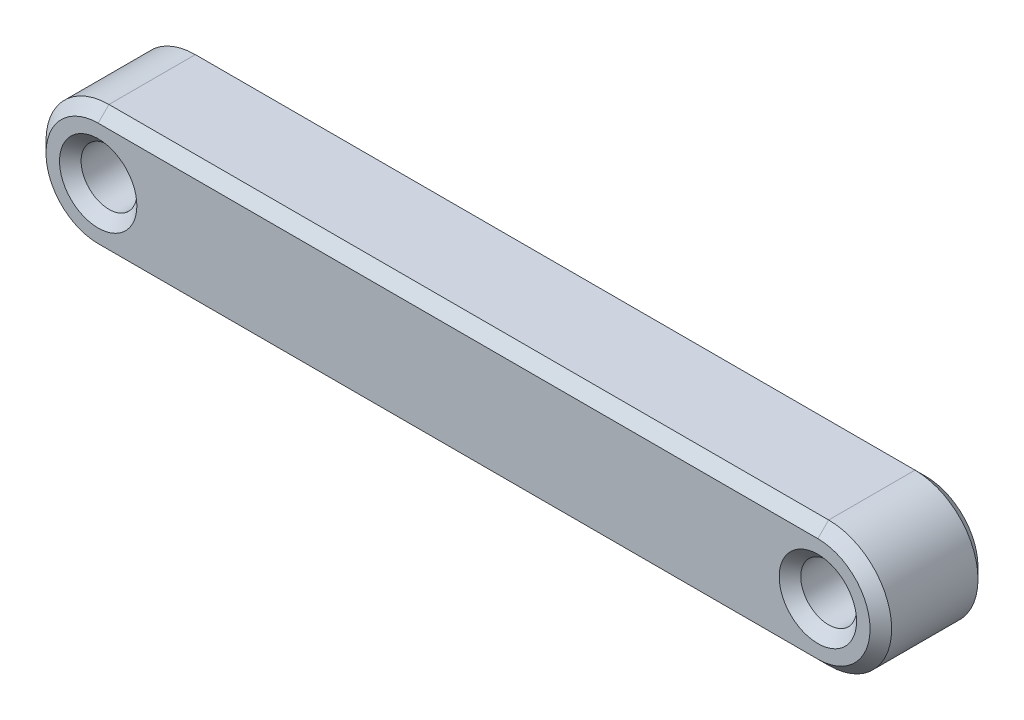
ISO-10303-21;
HEADER;
FILE_DESCRIPTION(('STEP AP214'),'2;1');
FILE_NAME('part.step','',(''),(''),'','','');
FILE_SCHEMA(('AUTOMOTIVE_DESIGN { 1 0 10303 214 1 1 1 1 }'));
ENDSEC;
DATA;
#1=APPLICATION_CONTEXT('core data for automotive mechanical design processes');
#2=APPLICATION_PROTOCOL_DEFINITION('international standard','automotive_design',2000,#1);
#3=PRODUCT_CONTEXT('',#1,'mechanical');
#4=PRODUCT('Part','Part','',(#3));
#5=PRODUCT_RELATED_PRODUCT_CATEGORY('part','',(#4));
#6=PRODUCT_DEFINITION_FORMATION('','',#4);
#7=PRODUCT_DEFINITION_CONTEXT('part definition',#1,'design');
#8=PRODUCT_DEFINITION('design','',#6,#7);
#9=PRODUCT_DEFINITION_SHAPE('','',#8);
#10=(LENGTH_UNIT() NAMED_UNIT(*) SI_UNIT(.MILLI.,.METRE.));
#11=(NAMED_UNIT(*) PLANE_ANGLE_UNIT() SI_UNIT($,.RADIAN.));
#12=(NAMED_UNIT(*) SI_UNIT($,.STERADIAN.) SOLID_ANGLE_UNIT());
#13=UNCERTAINTY_MEASURE_WITH_UNIT(LENGTH_MEASURE(1.E-05),#10,'distance_accuracy_value','');
#14=(GEOMETRIC_REPRESENTATION_CONTEXT(3) GLOBAL_UNCERTAINTY_ASSIGNED_CONTEXT((#13)) GLOBAL_UNIT_ASSIGNED_CONTEXT((#10,
#11,#12)) REPRESENTATION_CONTEXT('',''));
#15=CARTESIAN_POINT('',(0.,0.,0.));
#16=DIRECTION('',(0.,0.,1.));
#17=DIRECTION('',(1.,0.,0.));
#18=AXIS2_PLACEMENT_3D('',#15,#16,#17);
#19=CARTESIAN_POINT('',(0.,-3.5,6.));
#20=DIRECTION('',(0.,1.,0.));
#21=DIRECTION('',(0.,0.,1.));
#22=AXIS2_PLACEMENT_3D('',#19,#20,#21);
#23=PLANE('',#22);
#24=DIRECTION('',(0.,0.,-1.));
#25=VECTOR('',#24,1.);
#26=CARTESIAN_POINT('',(0.,-3.5,6.));
#27=LINE('',#26,#25);
#28=CARTESIAN_POINT('',(0.,-3.5,5.4));
#29=VERTEX_POINT('',#28);
#30=CARTESIAN_POINT('',(0.,-3.5,0.599999999999996));
#31=VERTEX_POINT('',#30);
#32=EDGE_CURVE('E185',#29,#31,#27,.T.);
#33=ORIENTED_EDGE('',*,*,#32,.T.);
#34=DIRECTION('',(1.,0.,0.));
#35=VECTOR('',#34,1.);
#36=CARTESIAN_POINT('',(0.,-3.5,0.599999999999996));
#37=LINE('',#36,#35);
#38=CARTESIAN_POINT('',(40.,-3.5,0.599999999999996));
#39=VERTEX_POINT('',#38);
#40=EDGE_CURVE('E171',#31,#39,#37,.T.);
#41=ORIENTED_EDGE('',*,*,#40,.T.);
#42=DIRECTION('',(0.,0.,-1.));
#43=VECTOR('',#42,1.);
#44=CARTESIAN_POINT('',(40.,-3.5,6.));
#45=LINE('',#44,#43);
#46=CARTESIAN_POINT('',(40.,-3.5,5.4));
#47=VERTEX_POINT('',#46);
#48=EDGE_CURVE('E130',#47,#39,#45,.T.);
#49=ORIENTED_EDGE('',*,*,#48,.F.);
#50=DIRECTION('',(-1.,0.,0.));
#51=VECTOR('',#50,1.);
#52=CARTESIAN_POINT('',(0.,-3.5,5.4));
#53=LINE('',#52,#51);
#54=EDGE_CURVE('E169',#47,#29,#53,.T.);
#55=ORIENTED_EDGE('',*,*,#54,.T.);
#56=EDGE_LOOP('',(#33,#41,#49,#55));
#57=FACE_BOUND('',#56,.T.);
#58=ADVANCED_FACE('F41',(#57),#23,.F.);
#59=CARTESIAN_POINT('',(40.,0.,6.));
#60=DIRECTION('',(0.,0.,-1.));
#61=DIRECTION('',(-1.,0.,0.));
#62=AXIS2_PLACEMENT_3D('',#59,#60,#61);
#63=CYLINDRICAL_SURFACE('',#62,3.5);
#64=ORIENTED_EDGE('',*,*,#48,.T.);
#65=CARTESIAN_POINT('',(40.,0.,0.599999999999996));
#66=DIRECTION('',(0.,0.,1.));
#67=DIRECTION('',(1.,0.,0.));
#68=AXIS2_PLACEMENT_3D('',#65,#66,#67);
#69=CIRCLE('',#68,3.5);
#70=CARTESIAN_POINT('',(40.,3.5,0.599999999999996));
#71=VERTEX_POINT('',#70);
#72=EDGE_CURVE('E116',#39,#71,#69,.T.);
#73=ORIENTED_EDGE('',*,*,#72,.T.);
#74=DIRECTION('',(0.,0.,-1.));
#75=VECTOR('',#74,1.);
#76=CARTESIAN_POINT('',(40.,3.5,6.));
#77=LINE('',#76,#75);
#78=CARTESIAN_POINT('',(40.,3.5,5.4));
#79=VERTEX_POINT('',#78);
#80=EDGE_CURVE('E207',#79,#71,#77,.T.);
#81=ORIENTED_EDGE('',*,*,#80,.F.);
#82=CARTESIAN_POINT('',(40.,0.,5.4));
#83=DIRECTION('',(0.,0.,1.));
#84=DIRECTION('',(1.,0.,0.));
#85=AXIS2_PLACEMENT_3D('',#82,#83,#84);
#86=CIRCLE('',#85,3.5);
#87=EDGE_CURVE('E157',#79,#47,#86,.F.);
#88=ORIENTED_EDGE('',*,*,#87,.T.);
#89=EDGE_LOOP('',(#64,#73,#81,#88));
#90=FACE_BOUND('',#89,.T.);
#91=ADVANCED_FACE('F205',(#90),#63,.T.);
#92=CARTESIAN_POINT('',(0.,3.5,6.));
#93=DIRECTION('',(0.,1.,0.));
#94=DIRECTION('',(0.,0.,1.));
#95=AXIS2_PLACEMENT_3D('',#92,#93,#94);
#96=PLANE('',#95);
#97=ORIENTED_EDGE('',*,*,#80,.T.);
#98=DIRECTION('',(-1.,0.,0.));
#99=VECTOR('',#98,1.);
#100=CARTESIAN_POINT('',(0.,3.5,0.599999999999996));
#101=LINE('',#100,#99);
#102=CARTESIAN_POINT('',(0.,3.5,0.599999999999996));
#103=VERTEX_POINT('',#102);
#104=EDGE_CURVE('E162',#71,#103,#101,.T.);
#105=ORIENTED_EDGE('',*,*,#104,.T.);
#106=DIRECTION('',(0.,0.,-1.));
#107=VECTOR('',#106,1.);
#108=CARTESIAN_POINT('',(0.,3.5,6.));
#109=LINE('',#108,#107);
#110=CARTESIAN_POINT('',(0.,3.5,5.4));
#111=VERTEX_POINT('',#110);
#112=EDGE_CURVE('E212',#111,#103,#109,.T.);
#113=ORIENTED_EDGE('',*,*,#112,.F.);
#114=DIRECTION('',(1.,0.,0.));
#115=VECTOR('',#114,1.);
#116=CARTESIAN_POINT('',(0.,3.5,5.4));
#117=LINE('',#116,#115);
#118=EDGE_CURVE('E160',#111,#79,#117,.T.);
#119=ORIENTED_EDGE('',*,*,#118,.T.);
#120=EDGE_LOOP('',(#97,#105,#113,#119));
#121=FACE_BOUND('',#120,.T.);
#122=ADVANCED_FACE('F225',(#121),#96,.T.);
#123=CARTESIAN_POINT('',(40.,0.,6.));
#124=DIRECTION('',(0.,0.,-1.));
#125=DIRECTION('',(-1.,0.,0.));
#126=AXIS2_PLACEMENT_3D('',#123,#124,#125);
#127=CYLINDRICAL_SURFACE('',#126,1.55);
#128=CARTESIAN_POINT('',(40.,0.,0.600000000000003));
#129=DIRECTION('',(0.,0.,1.));
#130=DIRECTION('',(1.,0.,0.));
#131=AXIS2_PLACEMENT_3D('',#128,#129,#130);
#132=CIRCLE('',#131,1.55);
#133=CARTESIAN_POINT('',(41.55,0.,0.600000000000003));
#134=VERTEX_POINT('',#133);
#135=EDGE_CURVE('E154',#134,#134,#132,.F.);
#136=ORIENTED_EDGE('',*,*,#135,.T.);
#137=EDGE_LOOP('',(#136));
#138=FACE_BOUND('',#137,.T.);
#139=CARTESIAN_POINT('',(40.,0.,5.40000000000001));
#140=DIRECTION('',(0.,0.,1.));
#141=DIRECTION('',(1.,0.,0.));
#142=AXIS2_PLACEMENT_3D('',#139,#140,#141);
#143=CIRCLE('',#142,1.55);
#144=CARTESIAN_POINT('',(41.55,0.,5.40000000000001));
#145=VERTEX_POINT('',#144);
#146=EDGE_CURVE('E151',#145,#145,#143,.T.);
#147=ORIENTED_EDGE('',*,*,#146,.T.);
#148=EDGE_LOOP('',(#147));
#149=FACE_BOUND('',#148,.T.);
#150=ADVANCED_FACE('F357',(#138,#149),#127,.F.);
#151=CARTESIAN_POINT('',(0.,0.,6.));
#152=DIRECTION('',(0.,0.,-1.));
#153=DIRECTION('',(-1.,0.,0.));
#154=AXIS2_PLACEMENT_3D('',#151,#152,#153);
#155=CYLINDRICAL_SURFACE('',#154,3.5);
#156=ORIENTED_EDGE('',*,*,#112,.T.);
#157=CARTESIAN_POINT('',(0.,0.,0.599999999999996));
#158=DIRECTION('',(0.,0.,1.));
#159=DIRECTION('',(1.,0.,0.));
#160=AXIS2_PLACEMENT_3D('',#157,#158,#159);
#161=CIRCLE('',#160,3.5);
#162=EDGE_CURVE('E167',#103,#31,#161,.T.);
#163=ORIENTED_EDGE('',*,*,#162,.T.);
#164=ORIENTED_EDGE('',*,*,#32,.F.);
#165=CARTESIAN_POINT('',(0.,0.,5.4));
#166=DIRECTION('',(0.,0.,1.));
#167=DIRECTION('',(1.,0.,0.));
#168=AXIS2_PLACEMENT_3D('',#165,#166,#167);
#169=CIRCLE('',#168,3.5);
#170=EDGE_CURVE('E164',#29,#111,#169,.F.);
#171=ORIENTED_EDGE('',*,*,#170,.T.);
#172=EDGE_LOOP('',(#156,#163,#164,#171));
#173=FACE_BOUND('',#172,.T.);
#174=ADVANCED_FACE('F229',(#173),#155,.T.);
#175=CARTESIAN_POINT('',(0.,0.,6.));
#176=DIRECTION('',(0.,0.,-1.));
#177=DIRECTION('',(-1.,0.,0.));
#178=AXIS2_PLACEMENT_3D('',#175,#176,#177);
#179=CYLINDRICAL_SURFACE('',#178,1.55);
#180=CARTESIAN_POINT('',(0.,0.,0.600000000000007));
#181=DIRECTION('',(0.,0.,1.));
#182=DIRECTION('',(1.,0.,0.));
#183=AXIS2_PLACEMENT_3D('',#180,#181,#182);
#184=CIRCLE('',#183,1.55);
#185=CARTESIAN_POINT('',(1.55,0.,0.600000000000007));
#186=VERTEX_POINT('',#185);
#187=EDGE_CURVE('E148',#186,#186,#184,.F.);
#188=ORIENTED_EDGE('',*,*,#187,.T.);
#189=EDGE_LOOP('',(#188));
#190=FACE_BOUND('',#189,.T.);
#191=CARTESIAN_POINT('',(0.,0.,5.40000000000002));
#192=DIRECTION('',(0.,0.,1.));
#193=DIRECTION('',(1.,0.,0.));
#194=AXIS2_PLACEMENT_3D('',#191,#192,#193);
#195=CIRCLE('',#194,1.55);
#196=CARTESIAN_POINT('',(1.55,0.,5.40000000000002));
#197=VERTEX_POINT('',#196);
#198=EDGE_CURVE('E145',#197,#197,#195,.T.);
#199=ORIENTED_EDGE('',*,*,#198,.T.);
#200=EDGE_LOOP('',(#199));
#201=FACE_BOUND('',#200,.T.);
#202=ADVANCED_FACE('F237',(#190,#201),#179,.F.);
#203=CARTESIAN_POINT('',(0.,0.,6.));
#204=DIRECTION('',(0.,0.,1.));
#205=DIRECTION('',(1.,0.,0.));
#206=AXIS2_PLACEMENT_3D('',#203,#204,#205);
#207=PLANE('',#206);
#208=CARTESIAN_POINT('',(0.,0.,6.));
#209=DIRECTION('',(0.,0.,1.));
#210=DIRECTION('',(1.,0.,0.));
#211=AXIS2_PLACEMENT_3D('',#208,#209,#210);
#212=CIRCLE('',#211,2.14999999999999);
#213=CARTESIAN_POINT('',(2.14999999999999,0.,6.));
#214=VERTEX_POINT('',#213);
#215=EDGE_CURVE('E11',#214,#214,#212,.F.);
#216=ORIENTED_EDGE('',*,*,#215,.T.);
#217=EDGE_LOOP('',(#216));
#218=FACE_BOUND('',#217,.T.);
#219=CARTESIAN_POINT('',(40.,0.,6.));
#220=DIRECTION('',(0.,0.,1.));
#221=DIRECTION('',(1.,0.,0.));
#222=AXIS2_PLACEMENT_3D('',#219,#220,#221);
#223=CIRCLE('',#222,2.14999999999999);
#224=CARTESIAN_POINT('',(42.15,0.,6.));
#225=VERTEX_POINT('',#224);
#226=EDGE_CURVE('E50',#225,#225,#223,.F.);
#227=ORIENTED_EDGE('',*,*,#226,.T.);
#228=EDGE_LOOP('',(#227));
#229=FACE_BOUND('',#228,.T.);
#230=DIRECTION('',(-1.,0.,0.));
#231=VECTOR('',#230,1.);
#232=CARTESIAN_POINT('',(0.,2.9,6.));
#233=LINE('',#232,#231);
#234=CARTESIAN_POINT('',(40.,2.9,6.));
#235=VERTEX_POINT('',#234);
#236=CARTESIAN_POINT('',(0.,2.9,6.));
#237=VERTEX_POINT('',#236);
#238=EDGE_CURVE('E58',#235,#237,#233,.T.);
#239=ORIENTED_EDGE('',*,*,#238,.T.);
#240=CARTESIAN_POINT('',(0.,0.,6.));
#241=DIRECTION('',(0.,0.,1.));
#242=DIRECTION('',(1.,0.,0.));
#243=AXIS2_PLACEMENT_3D('',#240,#241,#242);
#244=CIRCLE('',#243,2.9);
#245=CARTESIAN_POINT('',(0.,-2.9,6.));
#246=VERTEX_POINT('',#245);
#247=EDGE_CURVE('E177',#237,#246,#244,.T.);
#248=ORIENTED_EDGE('',*,*,#247,.T.);
#249=DIRECTION('',(1.,0.,0.));
#250=VECTOR('',#249,1.);
#251=CARTESIAN_POINT('',(40.,-2.9,6.));
#252=LINE('',#251,#250);
#253=CARTESIAN_POINT('',(40.,-2.9,6.));
#254=VERTEX_POINT('',#253);
#255=EDGE_CURVE('E173',#246,#254,#252,.T.);
#256=ORIENTED_EDGE('',*,*,#255,.T.);
#257=CARTESIAN_POINT('',(40.,0.,6.));
#258=DIRECTION('',(0.,0.,1.));
#259=DIRECTION('',(1.,0.,0.));
#260=AXIS2_PLACEMENT_3D('',#257,#258,#259);
#261=CIRCLE('',#260,2.9);
#262=EDGE_CURVE('E63',#254,#235,#261,.T.);
#263=ORIENTED_EDGE('',*,*,#262,.T.);
#264=EDGE_LOOP('',(#239,#248,#256,#263));
#265=FACE_BOUND('',#264,.T.);
#266=ADVANCED_FACE('F235',(#218,#229,#265),#207,.T.);
#267=CARTESIAN_POINT('',(0.,0.,0.));
#268=DIRECTION('',(0.,0.,1.));
#269=DIRECTION('',(1.,0.,0.));
#270=AXIS2_PLACEMENT_3D('',#267,#268,#269);
#271=PLANE('',#270);
#272=CARTESIAN_POINT('',(0.,0.,0.));
#273=DIRECTION('',(0.,0.,1.));
#274=DIRECTION('',(1.,0.,0.));
#275=AXIS2_PLACEMENT_3D('',#272,#273,#274);
#276=CIRCLE('',#275,2.15000000000001);
#277=CARTESIAN_POINT('',(2.15000000000001,0.,0.));
#278=VERTEX_POINT('',#277);
#279=EDGE_CURVE('E138',#278,#278,#276,.T.);
#280=ORIENTED_EDGE('',*,*,#279,.T.);
#281=EDGE_LOOP('',(#280));
#282=FACE_BOUND('',#281,.T.);
#283=CARTESIAN_POINT('',(40.,0.,0.));
#284=DIRECTION('',(0.,0.,1.));
#285=DIRECTION('',(1.,0.,0.));
#286=AXIS2_PLACEMENT_3D('',#283,#284,#285);
#287=CIRCLE('',#286,2.15000000000001);
#288=CARTESIAN_POINT('',(42.15,0.,0.));
#289=VERTEX_POINT('',#288);
#290=EDGE_CURVE('E135',#289,#289,#287,.T.);
#291=ORIENTED_EDGE('',*,*,#290,.T.);
#292=EDGE_LOOP('',(#291));
#293=FACE_BOUND('',#292,.T.);
#294=DIRECTION('',(1.,0.,0.));
#295=VECTOR('',#294,1.);
#296=CARTESIAN_POINT('',(40.,2.9,0.));
#297=LINE('',#296,#295);
#298=CARTESIAN_POINT('',(0.,2.9,0.));
#299=VERTEX_POINT('',#298);
#300=CARTESIAN_POINT('',(40.,2.9,0.));
#301=VERTEX_POINT('',#300);
#302=EDGE_CURVE('E134',#299,#301,#297,.T.);
#303=ORIENTED_EDGE('',*,*,#302,.T.);
#304=CARTESIAN_POINT('',(40.,0.,0.));
#305=DIRECTION('',(0.,0.,1.));
#306=DIRECTION('',(1.,0.,0.));
#307=AXIS2_PLACEMENT_3D('',#304,#305,#306);
#308=CIRCLE('',#307,2.9);
#309=CARTESIAN_POINT('',(40.,-2.9,0.));
#310=VERTEX_POINT('',#309);
#311=EDGE_CURVE('E113',#301,#310,#308,.F.);
#312=ORIENTED_EDGE('',*,*,#311,.T.);
#313=DIRECTION('',(-1.,0.,0.));
#314=VECTOR('',#313,1.);
#315=CARTESIAN_POINT('',(0.,-2.9,0.));
#316=LINE('',#315,#314);
#317=CARTESIAN_POINT('',(0.,-2.9,0.));
#318=VERTEX_POINT('',#317);
#319=EDGE_CURVE('E123',#310,#318,#316,.T.);
#320=ORIENTED_EDGE('',*,*,#319,.T.);
#321=CARTESIAN_POINT('',(0.,0.,0.));
#322=DIRECTION('',(0.,0.,1.));
#323=DIRECTION('',(1.,0.,0.));
#324=AXIS2_PLACEMENT_3D('',#321,#322,#323);
#325=CIRCLE('',#324,2.9);
#326=EDGE_CURVE('E129',#318,#299,#325,.F.);
#327=ORIENTED_EDGE('',*,*,#326,.T.);
#328=EDGE_LOOP('',(#303,#312,#320,#327));
#329=FACE_BOUND('',#328,.T.);
#330=ADVANCED_FACE('F132',(#282,#293,#329),#271,.F.);
#331=CARTESIAN_POINT('',(0.,0.,0.));
#332=DIRECTION('',(0.,0.,-1.));
#333=DIRECTION('',(-1.,0.,0.));
#334=AXIS2_PLACEMENT_3D('',#331,#332,#333);
#335=CONICAL_SURFACE('',#334,2.15000000000001,0.785398163397448);
#336=ORIENTED_EDGE('',*,*,#187,.F.);
#337=EDGE_LOOP('',(#336));
#338=FACE_BOUND('',#337,.T.);
#339=ORIENTED_EDGE('',*,*,#279,.F.);
#340=EDGE_LOOP('',(#339));
#341=FACE_BOUND('',#340,.T.);
#342=ADVANCED_FACE('F244',(#338,#341),#335,.F.);
#343=CARTESIAN_POINT('',(40.,0.,0.));
#344=DIRECTION('',(0.,0.,-1.));
#345=DIRECTION('',(-1.,0.,0.));
#346=AXIS2_PLACEMENT_3D('',#343,#344,#345);
#347=CONICAL_SURFACE('',#346,2.15000000000001,0.78539816339745);
#348=ORIENTED_EDGE('',*,*,#135,.F.);
#349=EDGE_LOOP('',(#348));
#350=FACE_BOUND('',#349,.T.);
#351=ORIENTED_EDGE('',*,*,#290,.F.);
#352=EDGE_LOOP('',(#351));
#353=FACE_BOUND('',#352,.T.);
#354=ADVANCED_FACE('F260',(#350,#353),#347,.F.);
#355=CARTESIAN_POINT('',(0.,0.,0.599999999999996));
#356=DIRECTION('',(0.,0.,1.));
#357=DIRECTION('',(1.,0.,0.));
#358=AXIS2_PLACEMENT_3D('',#355,#356,#357);
#359=CONICAL_SURFACE('',#358,3.5,0.785398163397448);
#360=DIRECTION('',(0.,0.707106781186547,0.707106781186547));
#361=VECTOR('',#360,1.);
#362=CARTESIAN_POINT('',(0.,2.9,0.));
#363=LINE('',#362,#361);
#364=EDGE_CURVE('E119',#299,#103,#363,.T.);
#365=ORIENTED_EDGE('',*,*,#364,.F.);
#366=ORIENTED_EDGE('',*,*,#326,.F.);
#367=DIRECTION('',(0.,0.707106781186547,-0.707106781186547));
#368=VECTOR('',#367,1.);
#369=CARTESIAN_POINT('',(0.,-3.5,0.599999999999996));
#370=LINE('',#369,#368);
#371=EDGE_CURVE('E126',#31,#318,#370,.T.);
#372=ORIENTED_EDGE('',*,*,#371,.F.);
#373=ORIENTED_EDGE('',*,*,#162,.F.);
#374=EDGE_LOOP('',(#365,#366,#372,#373));
#375=FACE_BOUND('',#374,.T.);
#376=ADVANCED_FACE('F218',(#375),#359,.T.);
#377=CARTESIAN_POINT('',(0.,-3.5,0.599999999999996));
#378=DIRECTION('',(0.,0.707106781186547,0.707106781186547));
#379=DIRECTION('',(1.,0.,0.));
#380=AXIS2_PLACEMENT_3D('',#377,#378,#379);
#381=PLANE('',#380);
#382=ORIENTED_EDGE('',*,*,#371,.T.);
#383=ORIENTED_EDGE('',*,*,#319,.F.);
#384=DIRECTION('',(0.,0.707106781186547,-0.707106781186547));
#385=VECTOR('',#384,1.);
#386=CARTESIAN_POINT('',(40.,-3.5,0.599999999999996));
#387=LINE('',#386,#385);
#388=EDGE_CURVE('E109',#39,#310,#387,.T.);
#389=ORIENTED_EDGE('',*,*,#388,.F.);
#390=ORIENTED_EDGE('',*,*,#40,.F.);
#391=EDGE_LOOP('',(#382,#383,#389,#390));
#392=FACE_BOUND('',#391,.T.);
#393=ADVANCED_FACE('F124',(#392),#381,.F.);
#394=CARTESIAN_POINT('',(0.,2.9,0.));
#395=DIRECTION('',(0.,0.707106781186547,-0.707106781186547));
#396=DIRECTION('',(-1.,0.,0.));
#397=AXIS2_PLACEMENT_3D('',#394,#395,#396);
#398=PLANE('',#397);
#399=ORIENTED_EDGE('',*,*,#364,.T.);
#400=ORIENTED_EDGE('',*,*,#104,.F.);
#401=DIRECTION('',(0.,0.707106781186547,0.707106781186547));
#402=VECTOR('',#401,1.);
#403=CARTESIAN_POINT('',(40.,2.9,0.));
#404=LINE('',#403,#402);
#405=EDGE_CURVE('E120',#301,#71,#404,.T.);
#406=ORIENTED_EDGE('',*,*,#405,.F.);
#407=ORIENTED_EDGE('',*,*,#302,.F.);
#408=EDGE_LOOP('',(#399,#400,#406,#407));
#409=FACE_BOUND('',#408,.T.);
#410=ADVANCED_FACE('F221',(#409),#398,.T.);
#411=CARTESIAN_POINT('',(40.,0.,0.599999999999996));
#412=DIRECTION('',(0.,0.,1.));
#413=DIRECTION('',(1.,0.,0.));
#414=AXIS2_PLACEMENT_3D('',#411,#412,#413);
#415=CONICAL_SURFACE('',#414,3.5,0.785398163397448);
#416=ORIENTED_EDGE('',*,*,#388,.T.);
#417=ORIENTED_EDGE('',*,*,#311,.F.);
#418=ORIENTED_EDGE('',*,*,#405,.T.);
#419=ORIENTED_EDGE('',*,*,#72,.F.);
#420=EDGE_LOOP('',(#416,#417,#418,#419));
#421=FACE_BOUND('',#420,.T.);
#422=ADVANCED_FACE('F111',(#421),#415,.T.);
#423=CARTESIAN_POINT('',(0.,0.,5.40000000000002));
#424=DIRECTION('',(0.,0.,1.));
#425=DIRECTION('',(1.,0.,0.));
#426=AXIS2_PLACEMENT_3D('',#423,#424,#425);
#427=CONICAL_SURFACE('',#426,1.55,0.785398163397456);
#428=ORIENTED_EDGE('',*,*,#215,.F.);
#429=EDGE_LOOP('',(#428));
#430=FACE_BOUND('',#429,.T.);
#431=ORIENTED_EDGE('',*,*,#198,.F.);
#432=EDGE_LOOP('',(#431));
#433=FACE_BOUND('',#432,.T.);
#434=ADVANCED_FACE('F267',(#430,#433),#427,.F.);
#435=CARTESIAN_POINT('',(40.,0.,5.40000000000001));
#436=DIRECTION('',(0.,0.,1.));
#437=DIRECTION('',(1.,0.,0.));
#438=AXIS2_PLACEMENT_3D('',#435,#436,#437);
#439=CONICAL_SURFACE('',#438,1.55,0.785398163397445);
#440=ORIENTED_EDGE('',*,*,#226,.F.);
#441=EDGE_LOOP('',(#440));
#442=FACE_BOUND('',#441,.T.);
#443=ORIENTED_EDGE('',*,*,#146,.F.);
#444=EDGE_LOOP('',(#443));
#445=FACE_BOUND('',#444,.T.);
#446=ADVANCED_FACE('F276',(#442,#445),#439,.F.);
#447=CARTESIAN_POINT('',(40.,0.,6.));
#448=DIRECTION('',(0.,0.,-1.));
#449=DIRECTION('',(-1.,0.,0.));
#450=AXIS2_PLACEMENT_3D('',#447,#448,#449);
#451=CONICAL_SURFACE('',#450,2.9,0.785398163397448);
#452=DIRECTION('',(0.,0.707106781186548,0.707106781186548));
#453=VECTOR('',#452,1.);
#454=CARTESIAN_POINT('',(40.,-3.5,5.4));
#455=LINE('',#454,#453);
#456=EDGE_CURVE('E189',#47,#254,#455,.T.);
#457=ORIENTED_EDGE('',*,*,#456,.F.);
#458=ORIENTED_EDGE('',*,*,#87,.F.);
#459=DIRECTION('',(0.,0.707106781186548,-0.707106781186548));
#460=VECTOR('',#459,1.);
#461=CARTESIAN_POINT('',(40.,2.9,6.));
#462=LINE('',#461,#460);
#463=EDGE_CURVE('E45',#235,#79,#462,.T.);
#464=ORIENTED_EDGE('',*,*,#463,.F.);
#465=ORIENTED_EDGE('',*,*,#262,.F.);
#466=EDGE_LOOP('',(#457,#458,#464,#465));
#467=FACE_BOUND('',#466,.T.);
#468=ADVANCED_FACE('F43',(#467),#451,.T.);
#469=CARTESIAN_POINT('',(0.,3.5,5.4));
#470=DIRECTION('',(0.,-0.707106781186548,-0.707106781186548));
#471=DIRECTION('',(1.,0.,0.));
#472=AXIS2_PLACEMENT_3D('',#469,#470,#471);
#473=PLANE('',#472);
#474=ORIENTED_EDGE('',*,*,#463,.T.);
#475=ORIENTED_EDGE('',*,*,#118,.F.);
#476=DIRECTION('',(0.,0.707106781186548,-0.707106781186548));
#477=VECTOR('',#476,1.);
#478=CARTESIAN_POINT('',(0.,2.9,6.));
#479=LINE('',#478,#477);
#480=EDGE_CURVE('E188',#237,#111,#479,.T.);
#481=ORIENTED_EDGE('',*,*,#480,.F.);
#482=ORIENTED_EDGE('',*,*,#238,.F.);
#483=EDGE_LOOP('',(#474,#475,#481,#482));
#484=FACE_BOUND('',#483,.T.);
#485=ADVANCED_FACE('F198',(#484),#473,.F.);
#486=CARTESIAN_POINT('',(0.,-2.9,6.));
#487=DIRECTION('',(0.,-0.707106781186548,0.707106781186548));
#488=DIRECTION('',(-1.,0.,0.));
#489=AXIS2_PLACEMENT_3D('',#486,#487,#488);
#490=PLANE('',#489);
#491=ORIENTED_EDGE('',*,*,#456,.T.);
#492=ORIENTED_EDGE('',*,*,#255,.F.);
#493=DIRECTION('',(0.,0.707106781186548,0.707106781186548));
#494=VECTOR('',#493,1.);
#495=CARTESIAN_POINT('',(0.,-3.5,5.4));
#496=LINE('',#495,#494);
#497=EDGE_CURVE('E186',#29,#246,#496,.T.);
#498=ORIENTED_EDGE('',*,*,#497,.F.);
#499=ORIENTED_EDGE('',*,*,#54,.F.);
#500=EDGE_LOOP('',(#491,#492,#498,#499));
#501=FACE_BOUND('',#500,.T.);
#502=ADVANCED_FACE('F234',(#501),#490,.T.);
#503=CARTESIAN_POINT('',(0.,0.,6.));
#504=DIRECTION('',(0.,0.,-1.));
#505=DIRECTION('',(-1.,0.,0.));
#506=AXIS2_PLACEMENT_3D('',#503,#504,#505);
#507=CONICAL_SURFACE('',#506,2.9,0.785398163397448);
#508=ORIENTED_EDGE('',*,*,#480,.T.);
#509=ORIENTED_EDGE('',*,*,#170,.F.);
#510=ORIENTED_EDGE('',*,*,#497,.T.);
#511=ORIENTED_EDGE('',*,*,#247,.F.);
#512=EDGE_LOOP('',(#508,#509,#510,#511));
#513=FACE_BOUND('',#512,.T.);
#514=ADVANCED_FACE('F232',(#513),#507,.T.);
#515=CLOSED_SHELL('',(#58,#91,#122,#150,#174,#202,#266,#330,#342,#354,#376,#393,#410,#422,#434,
#446,#468,#485,#502,#514));
#516=MANIFOLD_SOLID_BREP('B2',#515);
#517=ADVANCED_BREP_SHAPE_REPRESENTATION('',(#18,#516),#14);
#518=SHAPE_DEFINITION_REPRESENTATION(#9,#517);
ENDSEC;
END-ISO-10303-21;
